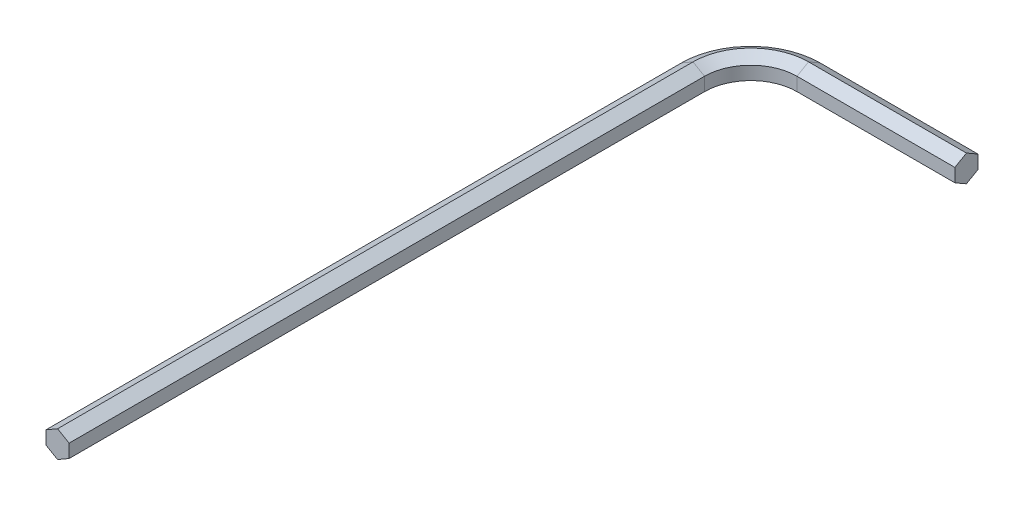
ISO-10303-21;
HEADER;
FILE_DESCRIPTION(('STEP AP214'),'2;1');
FILE_NAME('part.step','',(''),(''),'','','');
FILE_SCHEMA(('AUTOMOTIVE_DESIGN { 1 0 10303 214 1 1 1 1 }'));
ENDSEC;
DATA;
#1=APPLICATION_CONTEXT('core data for automotive mechanical design processes');
#2=APPLICATION_PROTOCOL_DEFINITION('international standard','automotive_design',2000,#1);
#3=PRODUCT_CONTEXT('',#1,'mechanical');
#4=PRODUCT('Part','Part','',(#3));
#5=PRODUCT_RELATED_PRODUCT_CATEGORY('part','',(#4));
#6=PRODUCT_DEFINITION_FORMATION('','',#4);
#7=PRODUCT_DEFINITION_CONTEXT('part definition',#1,'design');
#8=PRODUCT_DEFINITION('design','',#6,#7);
#9=PRODUCT_DEFINITION_SHAPE('','',#8);
#10=(LENGTH_UNIT() NAMED_UNIT(*) SI_UNIT(.MILLI.,.METRE.));
#11=(NAMED_UNIT(*) PLANE_ANGLE_UNIT() SI_UNIT($,.RADIAN.));
#12=(NAMED_UNIT(*) SI_UNIT($,.STERADIAN.) SOLID_ANGLE_UNIT());
#13=UNCERTAINTY_MEASURE_WITH_UNIT(LENGTH_MEASURE(1.E-05),#10,'distance_accuracy_value','');
#14=(GEOMETRIC_REPRESENTATION_CONTEXT(3) GLOBAL_UNCERTAINTY_ASSIGNED_CONTEXT((#13)) GLOBAL_UNIT_ASSIGNED_CONTEXT((#10,
#11,#12)) REPRESENTATION_CONTEXT('',''));
#15=CARTESIAN_POINT('',(0.,0.,0.));
#16=DIRECTION('',(0.,0.,1.));
#17=DIRECTION('',(1.,0.,0.));
#18=AXIS2_PLACEMENT_3D('',#15,#16,#17);
#19=CARTESIAN_POINT('',(0.,0.,0.));
#20=DIRECTION('',(0.,0.,1.));
#21=DIRECTION('',(1.,0.,0.));
#22=AXIS2_PLACEMENT_3D('',#19,#20,#21);
#23=PLANE('',#22);
#24=DIRECTION('',(0.866025403784439,-0.5,0.));
#25=VECTOR('',#24,1.);
#26=CARTESIAN_POINT('',(-0.75,-0.43301270189222,0.));
#27=LINE('',#26,#25);
#28=CARTESIAN_POINT('',(-0.75,-0.43301270189222,0.));
#29=VERTEX_POINT('',#28);
#30=CARTESIAN_POINT('',(0.,-0.866025403784439,0.));
#31=VERTEX_POINT('',#30);
#32=EDGE_CURVE('E188',#29,#31,#27,.T.);
#33=ORIENTED_EDGE('',*,*,#32,.T.);
#34=DIRECTION('',(0.866025403784438,0.500000000000001,0.));
#35=VECTOR('',#34,1.);
#36=CARTESIAN_POINT('',(0.,-0.866025403784439,0.));
#37=LINE('',#36,#35);
#38=CARTESIAN_POINT('',(0.75,-0.433012701892219,0.));
#39=VERTEX_POINT('',#38);
#40=EDGE_CURVE('E147',#31,#39,#37,.T.);
#41=ORIENTED_EDGE('',*,*,#40,.T.);
#42=DIRECTION('',(0.,1.,0.));
#43=VECTOR('',#42,1.);
#44=CARTESIAN_POINT('',(0.75,-0.433012701892219,0.));
#45=LINE('',#44,#43);
#46=CARTESIAN_POINT('',(0.75,0.43301270189222,0.));
#47=VERTEX_POINT('',#46);
#48=EDGE_CURVE('E139',#39,#47,#45,.T.);
#49=ORIENTED_EDGE('',*,*,#48,.T.);
#50=DIRECTION('',(-0.866025403784439,0.5,0.));
#51=VECTOR('',#50,1.);
#52=CARTESIAN_POINT('',(0.75,0.43301270189222,0.));
#53=LINE('',#52,#51);
#54=CARTESIAN_POINT('',(0.,0.866025403784439,0.));
#55=VERTEX_POINT('',#54);
#56=EDGE_CURVE('E132',#47,#55,#53,.T.);
#57=ORIENTED_EDGE('',*,*,#56,.T.);
#58=DIRECTION('',(-0.866025403784438,-0.5,0.));
#59=VECTOR('',#58,1.);
#60=CARTESIAN_POINT('',(0.,0.866025403784439,0.));
#61=LINE('',#60,#59);
#62=CARTESIAN_POINT('',(-0.750000000000001,0.433012701892219,0.));
#63=VERTEX_POINT('',#62);
#64=EDGE_CURVE('E213',#55,#63,#61,.T.);
#65=ORIENTED_EDGE('',*,*,#64,.T.);
#66=DIRECTION('',(0.,-1.,0.));
#67=VECTOR('',#66,1.);
#68=CARTESIAN_POINT('',(-0.750000000000001,0.433012701892219,0.));
#69=LINE('',#68,#67);
#70=EDGE_CURVE('E227',#63,#29,#69,.T.);
#71=ORIENTED_EDGE('',*,*,#70,.T.);
#72=EDGE_LOOP('',(#33,#41,#49,#57,#65,#71));
#73=FACE_BOUND('',#72,.T.);
#74=ADVANCED_FACE('F33',(#73),#23,.T.);
#75=CARTESIAN_POINT('',(14.,0.,-45.));
#76=DIRECTION('',(-1.,0.,0.));
#77=DIRECTION('',(0.,0.,1.));
#78=AXIS2_PLACEMENT_3D('',#75,#76,#77);
#79=PLANE('',#78);
#80=DIRECTION('',(0.,-0.5,0.866025403784439));
#81=VECTOR('',#80,1.);
#82=CARTESIAN_POINT('',(14.,-0.43301270189222,-45.75));
#83=LINE('',#82,#81);
#84=CARTESIAN_POINT('',(14.,-0.43301270189222,-45.75));
#85=VERTEX_POINT('',#84);
#86=CARTESIAN_POINT('',(14.,-0.866025403784439,-45.));
#87=VERTEX_POINT('',#86);
#88=EDGE_CURVE('E161',#85,#87,#83,.T.);
#89=ORIENTED_EDGE('',*,*,#88,.F.);
#90=DIRECTION('',(0.,-1.,0.));
#91=VECTOR('',#90,1.);
#92=CARTESIAN_POINT('',(14.,0.433012701892219,-45.75));
#93=LINE('',#92,#91);
#94=CARTESIAN_POINT('',(14.,0.433012701892219,-45.75));
#95=VERTEX_POINT('',#94);
#96=EDGE_CURVE('E11',#95,#85,#93,.T.);
#97=ORIENTED_EDGE('',*,*,#96,.F.);
#98=DIRECTION('',(0.,-0.5,-0.866025403784438));
#99=VECTOR('',#98,1.);
#100=CARTESIAN_POINT('',(14.,0.866025403784439,-45.));
#101=LINE('',#100,#99);
#102=CARTESIAN_POINT('',(14.,0.866025403784439,-45.));
#103=VERTEX_POINT('',#102);
#104=EDGE_CURVE('E47',#103,#95,#101,.T.);
#105=ORIENTED_EDGE('',*,*,#104,.F.);
#106=DIRECTION('',(0.,0.5,-0.866025403784439));
#107=VECTOR('',#106,1.);
#108=CARTESIAN_POINT('',(14.,0.43301270189222,-44.25));
#109=LINE('',#108,#107);
#110=CARTESIAN_POINT('',(14.,0.43301270189222,-44.25));
#111=VERTEX_POINT('',#110);
#112=EDGE_CURVE('E56',#111,#103,#109,.T.);
#113=ORIENTED_EDGE('',*,*,#112,.F.);
#114=DIRECTION('',(0.,1.,0.));
#115=VECTOR('',#114,1.);
#116=CARTESIAN_POINT('',(14.,-0.433012701892219,-44.25));
#117=LINE('',#116,#115);
#118=CARTESIAN_POINT('',(14.,-0.433012701892219,-44.25));
#119=VERTEX_POINT('',#118);
#120=EDGE_CURVE('E174',#119,#111,#117,.T.);
#121=ORIENTED_EDGE('',*,*,#120,.F.);
#122=DIRECTION('',(0.,0.500000000000001,0.866025403784438));
#123=VECTOR('',#122,1.);
#124=CARTESIAN_POINT('',(14.,-0.866025403784439,-45.));
#125=LINE('',#124,#123);
#126=EDGE_CURVE('E172',#87,#119,#125,.T.);
#127=ORIENTED_EDGE('',*,*,#126,.F.);
#128=EDGE_LOOP('',(#89,#97,#105,#113,#121,#127));
#129=FACE_BOUND('',#128,.T.);
#130=ADVANCED_FACE('F173',(#129),#79,.F.);
#131=CARTESIAN_POINT('',(-0.75,-0.43301270189222,0.));
#132=DIRECTION('',(0.5,0.866025403784439,0.));
#133=DIRECTION('',(-0.866025403784439,0.5,0.));
#134=AXIS2_PLACEMENT_3D('',#131,#132,#133);
#135=PLANE('',#134);
#136=DIRECTION('',(0.,0.,-1.));
#137=VECTOR('',#136,1.);
#138=CARTESIAN_POINT('',(0.,-0.866025403784439,0.));
#139=LINE('',#138,#137);
#140=CARTESIAN_POINT('',(0.,-0.866025403784439,-41.25));
#141=VERTEX_POINT('',#140);
#142=EDGE_CURVE('E193',#31,#141,#139,.T.);
#143=ORIENTED_EDGE('',*,*,#142,.F.);
#144=ORIENTED_EDGE('',*,*,#32,.F.);
#145=DIRECTION('',(0.,0.,-1.));
#146=VECTOR('',#145,1.);
#147=CARTESIAN_POINT('',(-0.75,-0.43301270189222,0.));
#148=LINE('',#147,#146);
#149=CARTESIAN_POINT('',(-0.75,-0.43301270189222,-41.25));
#150=VERTEX_POINT('',#149);
#151=EDGE_CURVE('E243',#29,#150,#148,.T.);
#152=ORIENTED_EDGE('',*,*,#151,.T.);
#153=DIRECTION('',(0.866025403784439,-0.5,0.));
#154=VECTOR('',#153,1.);
#155=CARTESIAN_POINT('',(-0.75,-0.43301270189222,-41.25));
#156=LINE('',#155,#154);
#157=EDGE_CURVE('E259',#150,#141,#156,.T.);
#158=ORIENTED_EDGE('',*,*,#157,.T.);
#159=EDGE_LOOP('',(#143,#144,#152,#158));
#160=FACE_BOUND('',#159,.T.);
#161=ADVANCED_FACE('F270',(#160),#135,.F.);
#162=CARTESIAN_POINT('',(0.,-0.866025403784439,0.));
#163=DIRECTION('',(-0.5,0.866025403784438,0.));
#164=DIRECTION('',(-0.866025403784438,-0.500000000000001,0.));
#165=AXIS2_PLACEMENT_3D('',#162,#163,#164);
#166=PLANE('',#165);
#167=DIRECTION('',(0.,0.,-1.));
#168=VECTOR('',#167,1.);
#169=CARTESIAN_POINT('',(0.75,-0.433012701892219,0.));
#170=LINE('',#169,#168);
#171=CARTESIAN_POINT('',(0.75,-0.433012701892219,-41.25));
#172=VERTEX_POINT('',#171);
#173=EDGE_CURVE('E192',#39,#172,#170,.T.);
#174=ORIENTED_EDGE('',*,*,#173,.F.);
#175=ORIENTED_EDGE('',*,*,#40,.F.);
#176=ORIENTED_EDGE('',*,*,#142,.T.);
#177=DIRECTION('',(0.866025403784438,0.500000000000001,0.));
#178=VECTOR('',#177,1.);
#179=CARTESIAN_POINT('',(0.,-0.866025403784439,-41.25));
#180=LINE('',#179,#178);
#181=EDGE_CURVE('E189',#141,#172,#180,.T.);
#182=ORIENTED_EDGE('',*,*,#181,.T.);
#183=EDGE_LOOP('',(#174,#175,#176,#182));
#184=FACE_BOUND('',#183,.T.);
#185=ADVANCED_FACE('F271',(#184),#166,.F.);
#186=CARTESIAN_POINT('',(0.75,-0.433012701892219,0.));
#187=DIRECTION('',(-1.,0.,0.));
#188=DIRECTION('',(0.,-1.,0.));
#189=AXIS2_PLACEMENT_3D('',#186,#187,#188);
#190=PLANE('',#189);
#191=DIRECTION('',(0.,0.,-1.));
#192=VECTOR('',#191,1.);
#193=CARTESIAN_POINT('',(0.75,0.43301270189222,0.));
#194=LINE('',#193,#192);
#195=CARTESIAN_POINT('',(0.75,0.43301270189222,-41.25));
#196=VERTEX_POINT('',#195);
#197=EDGE_CURVE('E204',#47,#196,#194,.T.);
#198=ORIENTED_EDGE('',*,*,#197,.F.);
#199=ORIENTED_EDGE('',*,*,#48,.F.);
#200=ORIENTED_EDGE('',*,*,#173,.T.);
#201=DIRECTION('',(0.,1.,0.));
#202=VECTOR('',#201,1.);
#203=CARTESIAN_POINT('',(0.75,-0.433012701892219,-41.25));
#204=LINE('',#203,#202);
#205=EDGE_CURVE('E195',#172,#196,#204,.T.);
#206=ORIENTED_EDGE('',*,*,#205,.T.);
#207=EDGE_LOOP('',(#198,#199,#200,#206));
#208=FACE_BOUND('',#207,.T.);
#209=ADVANCED_FACE('F324',(#208),#190,.F.);
#210=CARTESIAN_POINT('',(0.75,0.43301270189222,0.));
#211=DIRECTION('',(-0.5,-0.866025403784439,0.));
#212=DIRECTION('',(0.866025403784439,-0.5,0.));
#213=AXIS2_PLACEMENT_3D('',#210,#211,#212);
#214=PLANE('',#213);
#215=DIRECTION('',(0.,0.,-1.));
#216=VECTOR('',#215,1.);
#217=CARTESIAN_POINT('',(0.,0.866025403784439,0.));
#218=LINE('',#217,#216);
#219=CARTESIAN_POINT('',(0.,0.866025403784439,-41.25));
#220=VERTEX_POINT('',#219);
#221=EDGE_CURVE('E216',#55,#220,#218,.T.);
#222=ORIENTED_EDGE('',*,*,#221,.F.);
#223=ORIENTED_EDGE('',*,*,#56,.F.);
#224=ORIENTED_EDGE('',*,*,#197,.T.);
#225=DIRECTION('',(-0.866025403784439,0.5,0.));
#226=VECTOR('',#225,1.);
#227=CARTESIAN_POINT('',(0.75,0.43301270189222,-41.25));
#228=LINE('',#227,#226);
#229=EDGE_CURVE('E206',#196,#220,#228,.T.);
#230=ORIENTED_EDGE('',*,*,#229,.T.);
#231=EDGE_LOOP('',(#222,#223,#224,#230));
#232=FACE_BOUND('',#231,.T.);
#233=ADVANCED_FACE('F332',(#232),#214,.F.);
#234=CARTESIAN_POINT('',(0.,0.866025403784439,0.));
#235=DIRECTION('',(0.5,-0.866025403784438,0.));
#236=DIRECTION('',(0.866025403784439,0.5,0.));
#237=AXIS2_PLACEMENT_3D('',#234,#235,#236);
#238=PLANE('',#237);
#239=DIRECTION('',(0.,0.,-1.));
#240=VECTOR('',#239,1.);
#241=CARTESIAN_POINT('',(-0.750000000000001,0.433012701892219,0.));
#242=LINE('',#241,#240);
#243=CARTESIAN_POINT('',(-0.750000000000001,0.433012701892219,-41.25));
#244=VERTEX_POINT('',#243);
#245=EDGE_CURVE('E230',#63,#244,#242,.T.);
#246=ORIENTED_EDGE('',*,*,#245,.F.);
#247=ORIENTED_EDGE('',*,*,#64,.F.);
#248=ORIENTED_EDGE('',*,*,#221,.T.);
#249=DIRECTION('',(-0.866025403784438,-0.5,0.));
#250=VECTOR('',#249,1.);
#251=CARTESIAN_POINT('',(0.,0.866025403784439,-41.25));
#252=LINE('',#251,#250);
#253=EDGE_CURVE('E219',#220,#244,#252,.T.);
#254=ORIENTED_EDGE('',*,*,#253,.T.);
#255=EDGE_LOOP('',(#246,#247,#248,#254));
#256=FACE_BOUND('',#255,.T.);
#257=ADVANCED_FACE('F341',(#256),#238,.F.);
#258=CARTESIAN_POINT('',(-0.750000000000001,0.433012701892219,0.));
#259=DIRECTION('',(1.,0.,0.));
#260=DIRECTION('',(0.,1.,0.));
#261=AXIS2_PLACEMENT_3D('',#258,#259,#260);
#262=PLANE('',#261);
#263=DIRECTION('',(0.,-1.,0.));
#264=VECTOR('',#263,1.);
#265=CARTESIAN_POINT('',(-0.750000000000001,0.433012701892219,-41.25));
#266=LINE('',#265,#264);
#267=EDGE_CURVE('E233',#244,#150,#266,.T.);
#268=ORIENTED_EDGE('',*,*,#267,.T.);
#269=ORIENTED_EDGE('',*,*,#151,.F.);
#270=ORIENTED_EDGE('',*,*,#70,.F.);
#271=ORIENTED_EDGE('',*,*,#245,.T.);
#272=EDGE_LOOP('',(#268,#269,#270,#271));
#273=FACE_BOUND('',#272,.T.);
#274=ADVANCED_FACE('F282',(#273),#262,.F.);
#275=CARTESIAN_POINT('',(3.75,-0.43301270189222,-41.25));
#276=DIRECTION('',(0.,1.,0.));
#277=DIRECTION('',(0.,0.,1.));
#278=AXIS2_PLACEMENT_3D('',#275,#276,#277);
#279=CONICAL_SURFACE('',#278,4.5,1.0471975511966);
#280=CARTESIAN_POINT('',(3.75,-0.866025403784439,-41.25));
#281=DIRECTION('',(0.,-1.,0.));
#282=DIRECTION('',(-1.,0.,0.));
#283=AXIS2_PLACEMENT_3D('',#280,#281,#282);
#284=CIRCLE('',#283,3.75);
#285=CARTESIAN_POINT('',(3.75,-0.866025403784439,-45.));
#286=VERTEX_POINT('',#285);
#287=EDGE_CURVE('E197',#141,#286,#284,.T.);
#288=ORIENTED_EDGE('',*,*,#287,.F.);
#289=ORIENTED_EDGE('',*,*,#157,.F.);
#290=CARTESIAN_POINT('',(3.75,-0.43301270189222,-41.25));
#291=DIRECTION('',(0.,-1.,0.));
#292=DIRECTION('',(-1.,0.,0.));
#293=AXIS2_PLACEMENT_3D('',#290,#291,#292);
#294=CIRCLE('',#293,4.5);
#295=CARTESIAN_POINT('',(3.75,-0.43301270189222,-45.75));
#296=VERTEX_POINT('',#295);
#297=EDGE_CURVE('E245',#150,#296,#294,.T.);
#298=ORIENTED_EDGE('',*,*,#297,.T.);
#299=DIRECTION('',(0.,-0.5,0.866025403784439));
#300=VECTOR('',#299,1.);
#301=CARTESIAN_POINT('',(3.75,-0.43301270189222,-45.75));
#302=LINE('',#301,#300);
#303=EDGE_CURVE('E253',#296,#286,#302,.T.);
#304=ORIENTED_EDGE('',*,*,#303,.T.);
#305=EDGE_LOOP('',(#288,#289,#298,#304));
#306=FACE_BOUND('',#305,.T.);
#307=ADVANCED_FACE('F257',(#306),#279,.T.);
#308=CARTESIAN_POINT('',(3.75,-0.866025403784439,-41.25));
#309=DIRECTION('',(0.,-1.,0.));
#310=DIRECTION('',(0.,0.,-1.));
#311=AXIS2_PLACEMENT_3D('',#308,#309,#310);
#312=CONICAL_SURFACE('',#311,3.75,1.0471975511966);
#313=CARTESIAN_POINT('',(3.75,-0.433012701892219,-41.25));
#314=DIRECTION('',(0.,-1.,0.));
#315=DIRECTION('',(-1.,0.,0.));
#316=AXIS2_PLACEMENT_3D('',#313,#314,#315);
#317=CIRCLE('',#316,3.);
#318=CARTESIAN_POINT('',(3.75,-0.433012701892219,-44.25));
#319=VERTEX_POINT('',#318);
#320=EDGE_CURVE('E119',#172,#319,#317,.T.);
#321=ORIENTED_EDGE('',*,*,#320,.F.);
#322=ORIENTED_EDGE('',*,*,#181,.F.);
#323=ORIENTED_EDGE('',*,*,#287,.T.);
#324=DIRECTION('',(0.,0.500000000000001,0.866025403784438));
#325=VECTOR('',#324,1.);
#326=CARTESIAN_POINT('',(3.75,-0.866025403784439,-45.));
#327=LINE('',#326,#325);
#328=EDGE_CURVE('E180',#286,#319,#327,.T.);
#329=ORIENTED_EDGE('',*,*,#328,.T.);
#330=EDGE_LOOP('',(#321,#322,#323,#329));
#331=FACE_BOUND('',#330,.T.);
#332=ADVANCED_FACE('F272',(#331),#312,.F.);
#333=CARTESIAN_POINT('',(3.75,0.,-41.25));
#334=DIRECTION('',(0.,-1.,0.));
#335=DIRECTION('',(0.,0.,-1.));
#336=AXIS2_PLACEMENT_3D('',#333,#334,#335);
#337=CYLINDRICAL_SURFACE('',#336,3.);
#338=CARTESIAN_POINT('',(3.75,0.43301270189222,-41.25));
#339=DIRECTION('',(0.,-1.,0.));
#340=DIRECTION('',(-1.,0.,0.));
#341=AXIS2_PLACEMENT_3D('',#338,#339,#340);
#342=CIRCLE('',#341,3.);
#343=CARTESIAN_POINT('',(3.75,0.43301270189222,-44.25));
#344=VERTEX_POINT('',#343);
#345=EDGE_CURVE('E111',#196,#344,#342,.T.);
#346=ORIENTED_EDGE('',*,*,#345,.F.);
#347=ORIENTED_EDGE('',*,*,#205,.F.);
#348=ORIENTED_EDGE('',*,*,#320,.T.);
#349=DIRECTION('',(0.,1.,0.));
#350=VECTOR('',#349,1.);
#351=CARTESIAN_POINT('',(3.75,-0.433012701892219,-44.25));
#352=LINE('',#351,#350);
#353=EDGE_CURVE('E198',#319,#344,#352,.T.);
#354=ORIENTED_EDGE('',*,*,#353,.T.);
#355=EDGE_LOOP('',(#346,#347,#348,#354));
#356=FACE_BOUND('',#355,.T.);
#357=ADVANCED_FACE('F274',(#356),#337,.F.);
#358=CARTESIAN_POINT('',(3.75,0.43301270189222,-41.25));
#359=DIRECTION('',(0.,1.,0.));
#360=DIRECTION('',(0.,0.,1.));
#361=AXIS2_PLACEMENT_3D('',#358,#359,#360);
#362=CONICAL_SURFACE('',#361,3.,1.0471975511966);
#363=CARTESIAN_POINT('',(3.75,0.866025403784439,-41.25));
#364=DIRECTION('',(0.,-1.,0.));
#365=DIRECTION('',(-1.,0.,0.));
#366=AXIS2_PLACEMENT_3D('',#363,#364,#365);
#367=CIRCLE('',#366,3.75);
#368=CARTESIAN_POINT('',(3.75,0.866025403784439,-45.));
#369=VERTEX_POINT('',#368);
#370=EDGE_CURVE('E103',#220,#369,#367,.T.);
#371=ORIENTED_EDGE('',*,*,#370,.F.);
#372=ORIENTED_EDGE('',*,*,#229,.F.);
#373=ORIENTED_EDGE('',*,*,#345,.T.);
#374=DIRECTION('',(0.,0.5,-0.866025403784439));
#375=VECTOR('',#374,1.);
#376=CARTESIAN_POINT('',(3.75,0.43301270189222,-44.25));
#377=LINE('',#376,#375);
#378=EDGE_CURVE('E209',#344,#369,#377,.T.);
#379=ORIENTED_EDGE('',*,*,#378,.T.);
#380=EDGE_LOOP('',(#371,#372,#373,#379));
#381=FACE_BOUND('',#380,.T.);
#382=ADVANCED_FACE('F280',(#381),#362,.F.);
#383=CARTESIAN_POINT('',(3.75,0.866025403784439,-41.25));
#384=DIRECTION('',(0.,-1.,0.));
#385=DIRECTION('',(0.,0.,-1.));
#386=AXIS2_PLACEMENT_3D('',#383,#384,#385);
#387=CONICAL_SURFACE('',#386,3.75,1.0471975511966);
#388=CARTESIAN_POINT('',(3.75,0.433012701892219,-41.25));
#389=DIRECTION('',(0.,-1.,0.));
#390=DIRECTION('',(-1.,0.,0.));
#391=AXIS2_PLACEMENT_3D('',#388,#389,#390);
#392=CIRCLE('',#391,4.5);
#393=CARTESIAN_POINT('',(3.75,0.433012701892219,-45.75));
#394=VERTEX_POINT('',#393);
#395=EDGE_CURVE('E236',#244,#394,#392,.T.);
#396=ORIENTED_EDGE('',*,*,#395,.F.);
#397=ORIENTED_EDGE('',*,*,#253,.F.);
#398=ORIENTED_EDGE('',*,*,#370,.T.);
#399=DIRECTION('',(0.,-0.5,-0.866025403784438));
#400=VECTOR('',#399,1.);
#401=CARTESIAN_POINT('',(3.75,0.866025403784439,-45.));
#402=LINE('',#401,#400);
#403=EDGE_CURVE('E222',#369,#394,#402,.T.);
#404=ORIENTED_EDGE('',*,*,#403,.T.);
#405=EDGE_LOOP('',(#396,#397,#398,#404));
#406=FACE_BOUND('',#405,.T.);
#407=ADVANCED_FACE('F383',(#406),#387,.T.);
#408=CARTESIAN_POINT('',(3.75,0.,-41.25));
#409=DIRECTION('',(0.,-1.,0.));
#410=DIRECTION('',(0.,0.,-1.));
#411=AXIS2_PLACEMENT_3D('',#408,#409,#410);
#412=CYLINDRICAL_SURFACE('',#411,4.5);
#413=DIRECTION('',(0.,-1.,0.));
#414=VECTOR('',#413,1.);
#415=CARTESIAN_POINT('',(3.75,0.433012701892219,-45.75));
#416=LINE('',#415,#414);
#417=EDGE_CURVE('E186',#394,#296,#416,.T.);
#418=ORIENTED_EDGE('',*,*,#417,.T.);
#419=ORIENTED_EDGE('',*,*,#297,.F.);
#420=ORIENTED_EDGE('',*,*,#267,.F.);
#421=ORIENTED_EDGE('',*,*,#395,.T.);
#422=EDGE_LOOP('',(#418,#419,#420,#421));
#423=FACE_BOUND('',#422,.T.);
#424=ADVANCED_FACE('F248',(#423),#412,.T.);
#425=CARTESIAN_POINT('',(3.75,-0.43301270189222,-45.75));
#426=DIRECTION('',(0.,0.866025403784439,0.5));
#427=DIRECTION('',(0.,-0.5,0.866025403784439));
#428=AXIS2_PLACEMENT_3D('',#425,#426,#427);
#429=PLANE('',#428);
#430=DIRECTION('',(1.,0.,0.));
#431=VECTOR('',#430,1.);
#432=CARTESIAN_POINT('',(3.75,-0.866025403784439,-45.));
#433=LINE('',#432,#431);
#434=EDGE_CURVE('E166',#286,#87,#433,.T.);
#435=ORIENTED_EDGE('',*,*,#434,.F.);
#436=ORIENTED_EDGE('',*,*,#303,.F.);
#437=DIRECTION('',(1.,0.,0.));
#438=VECTOR('',#437,1.);
#439=CARTESIAN_POINT('',(3.75,-0.43301270189222,-45.75));
#440=LINE('',#439,#438);
#441=EDGE_CURVE('E168',#296,#85,#440,.T.);
#442=ORIENTED_EDGE('',*,*,#441,.T.);
#443=ORIENTED_EDGE('',*,*,#88,.T.);
#444=EDGE_LOOP('',(#435,#436,#442,#443));
#445=FACE_BOUND('',#444,.T.);
#446=ADVANCED_FACE('F163',(#445),#429,.F.);
#447=CARTESIAN_POINT('',(3.75,-0.866025403784439,-45.));
#448=DIRECTION('',(0.,0.866025403784438,-0.5));
#449=DIRECTION('',(0.,0.5,0.866025403784438));
#450=AXIS2_PLACEMENT_3D('',#447,#448,#449);
#451=PLANE('',#450);
#452=DIRECTION('',(1.,0.,0.));
#453=VECTOR('',#452,1.);
#454=CARTESIAN_POINT('',(3.75,-0.433012701892219,-44.25));
#455=LINE('',#454,#453);
#456=EDGE_CURVE('E177',#319,#119,#455,.T.);
#457=ORIENTED_EDGE('',*,*,#456,.F.);
#458=ORIENTED_EDGE('',*,*,#328,.F.);
#459=ORIENTED_EDGE('',*,*,#434,.T.);
#460=ORIENTED_EDGE('',*,*,#126,.T.);
#461=EDGE_LOOP('',(#457,#458,#459,#460));
#462=FACE_BOUND('',#461,.T.);
#463=ADVANCED_FACE('F179',(#462),#451,.F.);
#464=CARTESIAN_POINT('',(3.75,-0.433012701892219,-44.25));
#465=DIRECTION('',(0.,0.,-1.));
#466=DIRECTION('',(0.,1.,0.));
#467=AXIS2_PLACEMENT_3D('',#464,#465,#466);
#468=PLANE('',#467);
#469=DIRECTION('',(1.,0.,0.));
#470=VECTOR('',#469,1.);
#471=CARTESIAN_POINT('',(3.75,0.43301270189222,-44.25));
#472=LINE('',#471,#470);
#473=EDGE_CURVE('E88',#344,#111,#472,.T.);
#474=ORIENTED_EDGE('',*,*,#473,.F.);
#475=ORIENTED_EDGE('',*,*,#353,.F.);
#476=ORIENTED_EDGE('',*,*,#456,.T.);
#477=ORIENTED_EDGE('',*,*,#120,.T.);
#478=EDGE_LOOP('',(#474,#475,#476,#477));
#479=FACE_BOUND('',#478,.T.);
#480=ADVANCED_FACE('F416',(#479),#468,.F.);
#481=CARTESIAN_POINT('',(3.75,0.43301270189222,-44.25));
#482=DIRECTION('',(0.,-0.866025403784439,-0.5));
#483=DIRECTION('',(0.,0.5,-0.866025403784439));
#484=AXIS2_PLACEMENT_3D('',#481,#482,#483);
#485=PLANE('',#484);
#486=DIRECTION('',(1.,0.,0.));
#487=VECTOR('',#486,1.);
#488=CARTESIAN_POINT('',(3.75,0.866025403784439,-45.));
#489=LINE('',#488,#487);
#490=EDGE_CURVE('E82',#369,#103,#489,.T.);
#491=ORIENTED_EDGE('',*,*,#490,.F.);
#492=ORIENTED_EDGE('',*,*,#378,.F.);
#493=ORIENTED_EDGE('',*,*,#473,.T.);
#494=ORIENTED_EDGE('',*,*,#112,.T.);
#495=EDGE_LOOP('',(#491,#492,#493,#494));
#496=FACE_BOUND('',#495,.T.);
#497=ADVANCED_FACE('F293',(#496),#485,.F.);
#498=CARTESIAN_POINT('',(3.75,0.866025403784439,-45.));
#499=DIRECTION('',(0.,-0.866025403784439,0.5));
#500=DIRECTION('',(0.,-0.5,-0.866025403784438));
#501=AXIS2_PLACEMENT_3D('',#498,#499,#500);
#502=PLANE('',#501);
#503=DIRECTION('',(1.,0.,0.));
#504=VECTOR('',#503,1.);
#505=CARTESIAN_POINT('',(3.75,0.433012701892219,-45.75));
#506=LINE('',#505,#504);
#507=EDGE_CURVE('E40',#394,#95,#506,.T.);
#508=ORIENTED_EDGE('',*,*,#507,.F.);
#509=ORIENTED_EDGE('',*,*,#403,.F.);
#510=ORIENTED_EDGE('',*,*,#490,.T.);
#511=ORIENTED_EDGE('',*,*,#104,.T.);
#512=EDGE_LOOP('',(#508,#509,#510,#511));
#513=FACE_BOUND('',#512,.T.);
#514=ADVANCED_FACE('F288',(#513),#502,.F.);
#515=CARTESIAN_POINT('',(3.75,0.433012701892219,-45.75));
#516=DIRECTION('',(0.,0.,1.));
#517=DIRECTION('',(0.,-1.,0.));
#518=AXIS2_PLACEMENT_3D('',#515,#516,#517);
#519=PLANE('',#518);
#520=ORIENTED_EDGE('',*,*,#96,.T.);
#521=ORIENTED_EDGE('',*,*,#441,.F.);
#522=ORIENTED_EDGE('',*,*,#417,.F.);
#523=ORIENTED_EDGE('',*,*,#507,.T.);
#524=EDGE_LOOP('',(#520,#521,#522,#523));
#525=FACE_BOUND('',#524,.T.);
#526=ADVANCED_FACE('F286',(#525),#519,.F.);
#527=CLOSED_SHELL('',(#74,#130,#161,#185,#209,#233,#257,#274,#307,#332,#357,#382,#407,#424,#446,
#463,#480,#497,#514,#526));
#528=MANIFOLD_SOLID_BREP('B2',#527);
#529=ADVANCED_BREP_SHAPE_REPRESENTATION('',(#18,#528),#14);
#530=SHAPE_DEFINITION_REPRESENTATION(#9,#529);
ENDSEC;
END-ISO-10303-21;
